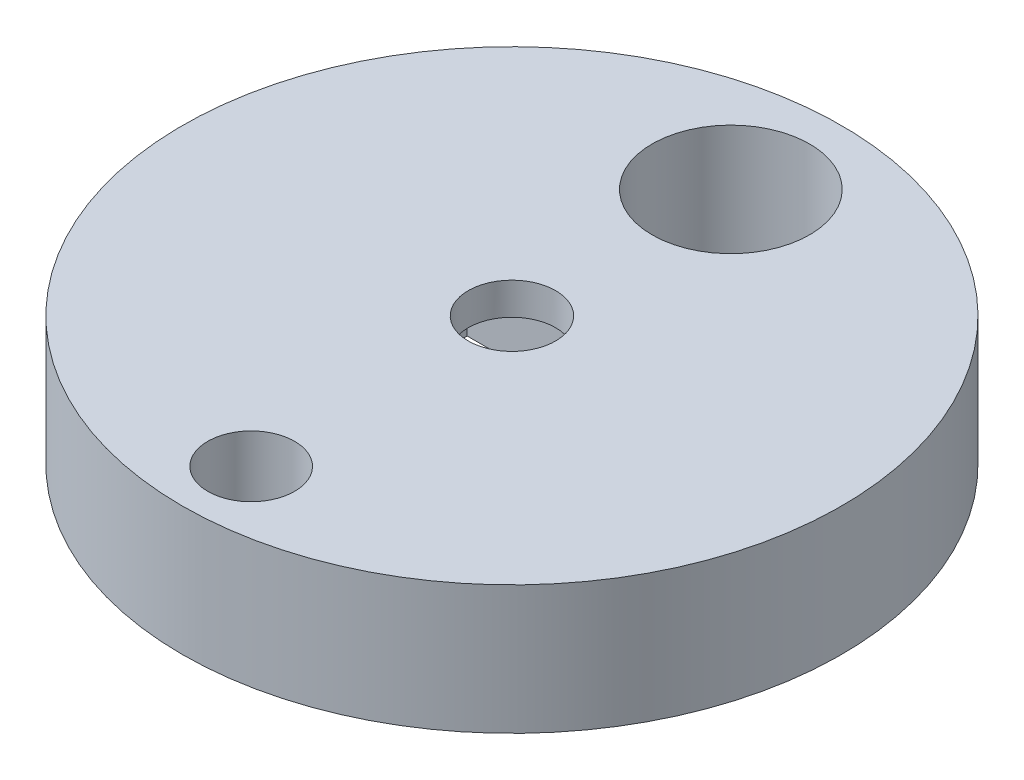
ISO-10303-21;
HEADER;
FILE_DESCRIPTION(('STEP AP214'),'2;1');
FILE_NAME('part.step','',(''),(''),'','','');
FILE_SCHEMA(('AUTOMOTIVE_DESIGN { 1 0 10303 214 1 1 1 1 }'));
ENDSEC;
DATA;
#1=APPLICATION_CONTEXT('core data for automotive mechanical design processes');
#2=APPLICATION_PROTOCOL_DEFINITION('international standard','automotive_design',2000,#1);
#3=PRODUCT_CONTEXT('',#1,'mechanical');
#4=PRODUCT('Part','Part','',(#3));
#5=PRODUCT_RELATED_PRODUCT_CATEGORY('part','',(#4));
#6=PRODUCT_DEFINITION_FORMATION('','',#4);
#7=PRODUCT_DEFINITION_CONTEXT('part definition',#1,'design');
#8=PRODUCT_DEFINITION('design','',#6,#7);
#9=PRODUCT_DEFINITION_SHAPE('','',#8);
#10=(LENGTH_UNIT() NAMED_UNIT(*) SI_UNIT(.MILLI.,.METRE.));
#11=(NAMED_UNIT(*) PLANE_ANGLE_UNIT() SI_UNIT($,.RADIAN.));
#12=(NAMED_UNIT(*) SI_UNIT($,.STERADIAN.) SOLID_ANGLE_UNIT());
#13=UNCERTAINTY_MEASURE_WITH_UNIT(LENGTH_MEASURE(1.E-05),#10,'distance_accuracy_value','');
#14=(GEOMETRIC_REPRESENTATION_CONTEXT(3) GLOBAL_UNCERTAINTY_ASSIGNED_CONTEXT((#13)) GLOBAL_UNIT_ASSIGNED_CONTEXT((#10,
#11,#12)) REPRESENTATION_CONTEXT('',''));
#15=CARTESIAN_POINT('',(0.,0.,0.));
#16=DIRECTION('',(0.,0.,1.));
#17=DIRECTION('',(1.,0.,0.));
#18=AXIS2_PLACEMENT_3D('',#15,#16,#17);
#19=CARTESIAN_POINT('',(0.,0.,0.));
#20=DIRECTION('',(0.,1.,0.));
#21=DIRECTION('',(0.,0.,1.));
#22=AXIS2_PLACEMENT_3D('',#19,#20,#21);
#23=PLANE('',#22);
#24=CARTESIAN_POINT('',(0.,0.,0.));
#25=DIRECTION('',(0.,1.,0.));
#26=DIRECTION('',(0.,0.,1.));
#27=AXIS2_PLACEMENT_3D('',#24,#25,#26);
#28=CIRCLE('',#27,26.035);
#29=CARTESIAN_POINT('',(0.,0.,26.035));
#30=VERTEX_POINT('',#29);
#31=EDGE_CURVE('E41',#30,#30,#28,.T.);
#32=ORIENTED_EDGE('',*,*,#31,.F.);
#33=EDGE_LOOP('',(#32));
#34=FACE_BOUND('',#33,.T.);
#35=CARTESIAN_POINT('',(0.,0.,20.5985760016958));
#36=DIRECTION('',(0.,1.,0.));
#37=DIRECTION('',(0.,0.,1.));
#38=AXIS2_PLACEMENT_3D('',#35,#36,#37);
#39=CIRCLE('',#38,3.429);
#40=CARTESIAN_POINT('',(0.,0.,24.0275760016958));
#41=VERTEX_POINT('',#40);
#42=EDGE_CURVE('E127',#41,#41,#39,.T.);
#43=ORIENTED_EDGE('',*,*,#42,.T.);
#44=EDGE_LOOP('',(#43));
#45=FACE_BOUND('',#44,.T.);
#46=CARTESIAN_POINT('',(0.,0.,-17.2930047520943));
#47=DIRECTION('',(0.,1.,0.));
#48=DIRECTION('',(0.,0.,1.));
#49=AXIS2_PLACEMENT_3D('',#46,#47,#48);
#50=CIRCLE('',#49,6.223);
#51=CARTESIAN_POINT('',(0.,0.,-11.0700047520943));
#52=VERTEX_POINT('',#51);
#53=EDGE_CURVE('E121',#52,#52,#50,.T.);
#54=ORIENTED_EDGE('',*,*,#53,.T.);
#55=EDGE_LOOP('',(#54));
#56=FACE_BOUND('',#55,.T.);
#57=DIRECTION('',(1.,0.,0.));
#58=VECTOR('',#57,1.);
#59=CARTESIAN_POINT('',(0.,0.,11.536));
#60=LINE('',#59,#58);
#61=CARTESIAN_POINT('',(-10.541,0.,11.536));
#62=VERTEX_POINT('',#61);
#63=CARTESIAN_POINT('',(10.541,0.,11.536));
#64=VERTEX_POINT('',#63);
#65=EDGE_CURVE('E52',#62,#64,#60,.T.);
#66=ORIENTED_EDGE('',*,*,#65,.T.);
#67=DIRECTION('',(0.,0.,-1.));
#68=VECTOR('',#67,1.);
#69=CARTESIAN_POINT('',(10.541,0.,0.));
#70=LINE('',#69,#68);
#71=CARTESIAN_POINT('',(10.541,0.,-7.006));
#72=VERTEX_POINT('',#71);
#73=EDGE_CURVE('E78',#64,#72,#70,.T.);
#74=ORIENTED_EDGE('',*,*,#73,.T.);
#75=DIRECTION('',(-1.,0.,0.));
#76=VECTOR('',#75,1.);
#77=CARTESIAN_POINT('',(0.,0.,-7.006));
#78=LINE('',#77,#76);
#79=CARTESIAN_POINT('',(-10.541,0.,-7.006));
#80=VERTEX_POINT('',#79);
#81=EDGE_CURVE('E113',#72,#80,#78,.T.);
#82=ORIENTED_EDGE('',*,*,#81,.T.);
#83=DIRECTION('',(0.,0.,1.));
#84=VECTOR('',#83,1.);
#85=CARTESIAN_POINT('',(-10.541,0.,0.));
#86=LINE('',#85,#84);
#87=EDGE_CURVE('E97',#80,#62,#86,.T.);
#88=ORIENTED_EDGE('',*,*,#87,.T.);
#89=EDGE_LOOP('',(#66,#74,#82,#88));
#90=FACE_BOUND('',#89,.T.);
#91=ADVANCED_FACE('F37',(#34,#45,#56,#90),#23,.F.);
#92=CARTESIAN_POINT('',(0.,0.,0.));
#93=DIRECTION('',(0.,1.,0.));
#94=DIRECTION('',(0.,0.,1.));
#95=AXIS2_PLACEMENT_3D('',#92,#93,#94);
#96=CYLINDRICAL_SURFACE('',#95,3.45);
#97=CARTESIAN_POINT('',(0.,10.16,0.));
#98=DIRECTION('',(0.,1.,0.));
#99=DIRECTION('',(0.,0.,1.));
#100=AXIS2_PLACEMENT_3D('',#97,#98,#99);
#101=CIRCLE('',#100,3.45);
#102=CARTESIAN_POINT('',(0.,10.16,3.45));
#103=VERTEX_POINT('',#102);
#104=EDGE_CURVE('E118',#103,#103,#101,.T.);
#105=ORIENTED_EDGE('',*,*,#104,.T.);
#106=EDGE_LOOP('',(#105));
#107=FACE_BOUND('',#106,.T.);
#108=CARTESIAN_POINT('',(0.,7.62,0.));
#109=DIRECTION('',(0.,-1.,0.));
#110=DIRECTION('',(0.,0.,-1.));
#111=AXIS2_PLACEMENT_3D('',#108,#109,#110);
#112=CIRCLE('',#111,3.45);
#113=CARTESIAN_POINT('',(0.,7.62,-3.45));
#114=VERTEX_POINT('',#113);
#115=EDGE_CURVE('E108',#114,#114,#112,.F.);
#116=ORIENTED_EDGE('',*,*,#115,.F.);
#117=EDGE_LOOP('',(#116));
#118=FACE_BOUND('',#117,.T.);
#119=ADVANCED_FACE('F136',(#107,#118),#96,.F.);
#120=CARTESIAN_POINT('',(0.,10.16,0.));
#121=DIRECTION('',(0.,-1.,0.));
#122=DIRECTION('',(0.,0.,-1.));
#123=AXIS2_PLACEMENT_3D('',#120,#121,#122);
#124=CYLINDRICAL_SURFACE('',#123,26.035);
#125=CARTESIAN_POINT('',(0.,10.16,0.));
#126=DIRECTION('',(0.,1.,0.));
#127=DIRECTION('',(0.,0.,1.));
#128=AXIS2_PLACEMENT_3D('',#125,#126,#127);
#129=CIRCLE('',#128,26.035);
#130=CARTESIAN_POINT('',(0.,10.16,26.035));
#131=VERTEX_POINT('',#130);
#132=EDGE_CURVE('E11',#131,#131,#129,.T.);
#133=ORIENTED_EDGE('',*,*,#132,.F.);
#134=EDGE_LOOP('',(#133));
#135=FACE_BOUND('',#134,.T.);
#136=ORIENTED_EDGE('',*,*,#31,.T.);
#137=EDGE_LOOP('',(#136));
#138=FACE_BOUND('',#137,.T.);
#139=ADVANCED_FACE('F39',(#135,#138),#124,.T.);
#140=CARTESIAN_POINT('',(0.,10.16,0.));
#141=DIRECTION('',(0.,1.,0.));
#142=DIRECTION('',(0.,0.,1.));
#143=AXIS2_PLACEMENT_3D('',#140,#141,#142);
#144=PLANE('',#143);
#145=CARTESIAN_POINT('',(0.,10.16,-17.2930047520943));
#146=DIRECTION('',(0.,1.,0.));
#147=DIRECTION('',(0.,0.,1.));
#148=AXIS2_PLACEMENT_3D('',#145,#146,#147);
#149=CIRCLE('',#148,6.223);
#150=CARTESIAN_POINT('',(0.,10.16,-11.0700047520943));
#151=VERTEX_POINT('',#150);
#152=EDGE_CURVE('E124',#151,#151,#149,.T.);
#153=ORIENTED_EDGE('',*,*,#152,.F.);
#154=EDGE_LOOP('',(#153));
#155=FACE_BOUND('',#154,.T.);
#156=CARTESIAN_POINT('',(0.,10.16,20.5985760016958));
#157=DIRECTION('',(0.,1.,0.));
#158=DIRECTION('',(0.,0.,1.));
#159=AXIS2_PLACEMENT_3D('',#156,#157,#158);
#160=CIRCLE('',#159,3.429);
#161=CARTESIAN_POINT('',(0.,10.16,24.0275760016958));
#162=VERTEX_POINT('',#161);
#163=EDGE_CURVE('E130',#162,#162,#160,.T.);
#164=ORIENTED_EDGE('',*,*,#163,.F.);
#165=EDGE_LOOP('',(#164));
#166=FACE_BOUND('',#165,.T.);
#167=ORIENTED_EDGE('',*,*,#104,.F.);
#168=EDGE_LOOP('',(#167));
#169=FACE_BOUND('',#168,.T.);
#170=ORIENTED_EDGE('',*,*,#132,.T.);
#171=EDGE_LOOP('',(#170));
#172=FACE_BOUND('',#171,.T.);
#173=ADVANCED_FACE('F139',(#155,#166,#169,#172),#144,.T.);
#174=CARTESIAN_POINT('',(0.,0.,20.5985760016958));
#175=DIRECTION('',(0.,1.,0.));
#176=DIRECTION('',(0.,0.,1.));
#177=AXIS2_PLACEMENT_3D('',#174,#175,#176);
#178=CYLINDRICAL_SURFACE('',#177,3.429);
#179=ORIENTED_EDGE('',*,*,#42,.F.);
#180=EDGE_LOOP('',(#179));
#181=FACE_BOUND('',#180,.T.);
#182=ORIENTED_EDGE('',*,*,#163,.T.);
#183=EDGE_LOOP('',(#182));
#184=FACE_BOUND('',#183,.T.);
#185=ADVANCED_FACE('F142',(#181,#184),#178,.F.);
#186=CARTESIAN_POINT('',(0.,0.,-17.2930047520943));
#187=DIRECTION('',(0.,1.,0.));
#188=DIRECTION('',(0.,0.,1.));
#189=AXIS2_PLACEMENT_3D('',#186,#187,#188);
#190=CYLINDRICAL_SURFACE('',#189,6.223);
#191=ORIENTED_EDGE('',*,*,#53,.F.);
#192=EDGE_LOOP('',(#191));
#193=FACE_BOUND('',#192,.T.);
#194=ORIENTED_EDGE('',*,*,#152,.T.);
#195=EDGE_LOOP('',(#194));
#196=FACE_BOUND('',#195,.T.);
#197=ADVANCED_FACE('F159',(#193,#196),#190,.F.);
#198=CARTESIAN_POINT('',(0.,7.62,11.536));
#199=DIRECTION('',(0.,0.,-1.));
#200=DIRECTION('',(-1.,0.,0.));
#201=AXIS2_PLACEMENT_3D('',#198,#199,#200);
#202=PLANE('',#201);
#203=ORIENTED_EDGE('',*,*,#65,.F.);
#204=DIRECTION('',(0.,-1.,0.));
#205=VECTOR('',#204,1.);
#206=CARTESIAN_POINT('',(-10.541,7.62,11.536));
#207=LINE('',#206,#205);
#208=CARTESIAN_POINT('',(-10.541,7.62,11.536));
#209=VERTEX_POINT('',#208);
#210=EDGE_CURVE('E99',#209,#62,#207,.T.);
#211=ORIENTED_EDGE('',*,*,#210,.F.);
#212=DIRECTION('',(1.,0.,0.));
#213=VECTOR('',#212,1.);
#214=CARTESIAN_POINT('',(0.,7.62,11.536));
#215=LINE('',#214,#213);
#216=CARTESIAN_POINT('',(10.541,7.62,11.536));
#217=VERTEX_POINT('',#216);
#218=EDGE_CURVE('E103',#209,#217,#215,.T.);
#219=ORIENTED_EDGE('',*,*,#218,.T.);
#220=DIRECTION('',(0.,-1.,0.));
#221=VECTOR('',#220,1.);
#222=CARTESIAN_POINT('',(10.541,7.62,11.536));
#223=LINE('',#222,#221);
#224=EDGE_CURVE('E116',#217,#64,#223,.T.);
#225=ORIENTED_EDGE('',*,*,#224,.T.);
#226=EDGE_LOOP('',(#203,#211,#219,#225));
#227=FACE_BOUND('',#226,.T.);
#228=ADVANCED_FACE('F162',(#227),#202,.T.);
#229=CARTESIAN_POINT('',(10.541,7.62,0.));
#230=DIRECTION('',(-1.,0.,0.));
#231=DIRECTION('',(0.,0.,1.));
#232=AXIS2_PLACEMENT_3D('',#229,#230,#231);
#233=PLANE('',#232);
#234=ORIENTED_EDGE('',*,*,#73,.F.);
#235=ORIENTED_EDGE('',*,*,#224,.F.);
#236=DIRECTION('',(0.,0.,-1.));
#237=VECTOR('',#236,1.);
#238=CARTESIAN_POINT('',(10.541,7.62,0.));
#239=LINE('',#238,#237);
#240=CARTESIAN_POINT('',(10.541,7.62,-7.006));
#241=VERTEX_POINT('',#240);
#242=EDGE_CURVE('E61',#217,#241,#239,.T.);
#243=ORIENTED_EDGE('',*,*,#242,.T.);
#244=DIRECTION('',(0.,-1.,0.));
#245=VECTOR('',#244,1.);
#246=CARTESIAN_POINT('',(10.541,7.62,-7.006));
#247=LINE('',#246,#245);
#248=EDGE_CURVE('E93',#241,#72,#247,.T.);
#249=ORIENTED_EDGE('',*,*,#248,.T.);
#250=EDGE_LOOP('',(#234,#235,#243,#249));
#251=FACE_BOUND('',#250,.T.);
#252=ADVANCED_FACE('F214',(#251),#233,.T.);
#253=CARTESIAN_POINT('',(0.,7.62,-7.006));
#254=DIRECTION('',(0.,0.,1.));
#255=DIRECTION('',(1.,0.,0.));
#256=AXIS2_PLACEMENT_3D('',#253,#254,#255);
#257=PLANE('',#256);
#258=ORIENTED_EDGE('',*,*,#81,.F.);
#259=ORIENTED_EDGE('',*,*,#248,.F.);
#260=DIRECTION('',(-1.,0.,0.));
#261=VECTOR('',#260,1.);
#262=CARTESIAN_POINT('',(0.,7.62,-7.006));
#263=LINE('',#262,#261);
#264=CARTESIAN_POINT('',(-10.541,7.62,-7.006));
#265=VERTEX_POINT('',#264);
#266=EDGE_CURVE('E88',#241,#265,#263,.T.);
#267=ORIENTED_EDGE('',*,*,#266,.T.);
#268=DIRECTION('',(0.,-1.,0.));
#269=VECTOR('',#268,1.);
#270=CARTESIAN_POINT('',(-10.541,7.62,-7.006));
#271=LINE('',#270,#269);
#272=EDGE_CURVE('E91',#265,#80,#271,.T.);
#273=ORIENTED_EDGE('',*,*,#272,.T.);
#274=EDGE_LOOP('',(#258,#259,#267,#273));
#275=FACE_BOUND('',#274,.T.);
#276=ADVANCED_FACE('F90',(#275),#257,.T.);
#277=CARTESIAN_POINT('',(-10.541,7.62,0.));
#278=DIRECTION('',(1.,0.,0.));
#279=DIRECTION('',(0.,0.,-1.));
#280=AXIS2_PLACEMENT_3D('',#277,#278,#279);
#281=PLANE('',#280);
#282=ORIENTED_EDGE('',*,*,#87,.F.);
#283=ORIENTED_EDGE('',*,*,#272,.F.);
#284=DIRECTION('',(0.,0.,1.));
#285=VECTOR('',#284,1.);
#286=CARTESIAN_POINT('',(-10.541,7.62,0.));
#287=LINE('',#286,#285);
#288=EDGE_CURVE('E84',#265,#209,#287,.T.);
#289=ORIENTED_EDGE('',*,*,#288,.T.);
#290=ORIENTED_EDGE('',*,*,#210,.T.);
#291=EDGE_LOOP('',(#282,#283,#289,#290));
#292=FACE_BOUND('',#291,.T.);
#293=ADVANCED_FACE('F95',(#292),#281,.T.);
#294=CARTESIAN_POINT('',(0.,7.62,0.));
#295=DIRECTION('',(0.,-1.,0.));
#296=DIRECTION('',(0.,0.,-1.));
#297=AXIS2_PLACEMENT_3D('',#294,#295,#296);
#298=PLANE('',#297);
#299=ORIENTED_EDGE('',*,*,#218,.F.);
#300=ORIENTED_EDGE('',*,*,#288,.F.);
#301=ORIENTED_EDGE('',*,*,#266,.F.);
#302=ORIENTED_EDGE('',*,*,#242,.F.);
#303=EDGE_LOOP('',(#299,#300,#301,#302));
#304=FACE_BOUND('',#303,.T.);
#305=ORIENTED_EDGE('',*,*,#115,.T.);
#306=EDGE_LOOP('',(#305));
#307=FACE_BOUND('',#306,.T.);
#308=ADVANCED_FACE('F101',(#304,#307),#298,.T.);
#309=CLOSED_SHELL('',(#91,#119,#139,#173,#185,#197,#228,#252,#276,#293,#308));
#310=MANIFOLD_SOLID_BREP('B2',#309);
#311=ADVANCED_BREP_SHAPE_REPRESENTATION('',(#18,#310),#14);
#312=SHAPE_DEFINITION_REPRESENTATION(#9,#311);
ENDSEC;
END-ISO-10303-21;
